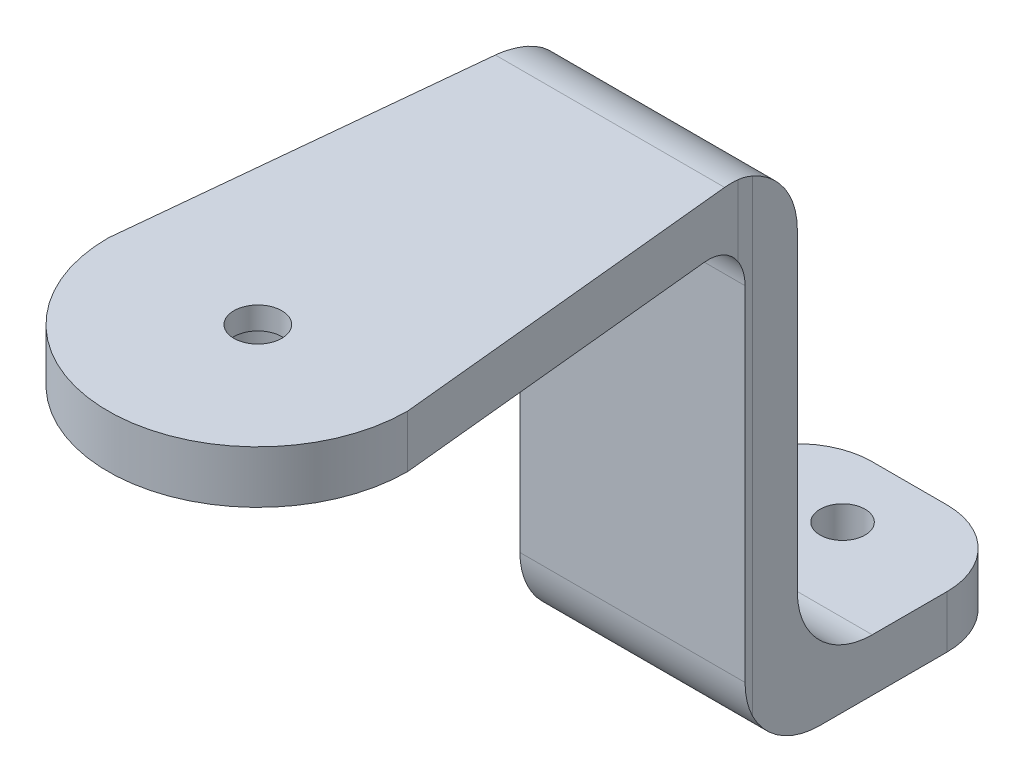
ISO-10303-21;
HEADER;
FILE_DESCRIPTION(('STEP AP214'),'2;1');
FILE_NAME('part.step','',(''),(''),'','','');
FILE_SCHEMA(('AUTOMOTIVE_DESIGN { 1 0 10303 214 1 1 1 1 }'));
ENDSEC;
DATA;
#1=APPLICATION_CONTEXT('core data for automotive mechanical design processes');
#2=APPLICATION_PROTOCOL_DEFINITION('international standard','automotive_design',2000,#1);
#3=PRODUCT_CONTEXT('',#1,'mechanical');
#4=PRODUCT('Part','Part','',(#3));
#5=PRODUCT_RELATED_PRODUCT_CATEGORY('part','',(#4));
#6=PRODUCT_DEFINITION_FORMATION('','',#4);
#7=PRODUCT_DEFINITION_CONTEXT('part definition',#1,'design');
#8=PRODUCT_DEFINITION('design','',#6,#7);
#9=PRODUCT_DEFINITION_SHAPE('','',#8);
#10=(LENGTH_UNIT() NAMED_UNIT(*) SI_UNIT(.MILLI.,.METRE.));
#11=(NAMED_UNIT(*) PLANE_ANGLE_UNIT() SI_UNIT($,.RADIAN.));
#12=(NAMED_UNIT(*) SI_UNIT($,.STERADIAN.) SOLID_ANGLE_UNIT());
#13=UNCERTAINTY_MEASURE_WITH_UNIT(LENGTH_MEASURE(1.E-05),#10,'distance_accuracy_value','');
#14=(GEOMETRIC_REPRESENTATION_CONTEXT(3) GLOBAL_UNCERTAINTY_ASSIGNED_CONTEXT((#13)) GLOBAL_UNIT_ASSIGNED_CONTEXT((#10,
#11,#12)) REPRESENTATION_CONTEXT('',''));
#15=CARTESIAN_POINT('',(0.,0.,0.));
#16=DIRECTION('',(0.,0.,1.));
#17=DIRECTION('',(1.,0.,0.));
#18=AXIS2_PLACEMENT_3D('',#15,#16,#17);
#19=CARTESIAN_POINT('',(10.,0.,0.));
#20=DIRECTION('',(0.,1.,0.));
#21=DIRECTION('',(0.,0.,1.));
#22=AXIS2_PLACEMENT_3D('',#19,#20,#21);
#23=PLANE('',#22);
#24=DIRECTION('',(0.0995037190209989,0.,-0.995037190209989));
#25=VECTOR('',#24,1.);
#26=CARTESIAN_POINT('',(0.0990099009900991,0.,-0.99009900990099));
#27=LINE('',#26,#25);
#28=CARTESIAN_POINT('',(0.,0.,0.));
#29=VERTEX_POINT('',#28);
#30=CARTESIAN_POINT('',(2.2,0.,-22.));
#31=VERTEX_POINT('',#30);
#32=EDGE_CURVE('E215',#29,#31,#27,.T.);
#33=ORIENTED_EDGE('',*,*,#32,.T.);
#34=DIRECTION('',(-1.,0.,0.));
#35=VECTOR('',#34,1.);
#36=CARTESIAN_POINT('',(17.5,0.,-22.));
#37=LINE('',#36,#35);
#38=CARTESIAN_POINT('',(17.8,0.,-22.));
#39=VERTEX_POINT('',#38);
#40=EDGE_CURVE('E255',#31,#39,#37,.F.);
#41=ORIENTED_EDGE('',*,*,#40,.T.);
#42=DIRECTION('',(0.0995037190209989,0.,0.995037190209989));
#43=VECTOR('',#42,1.);
#44=CARTESIAN_POINT('',(19.9009900990099,0.,-0.99009900990099));
#45=LINE('',#44,#43);
#46=CARTESIAN_POINT('',(20.,0.,0.));
#47=VERTEX_POINT('',#46);
#48=EDGE_CURVE('E219',#39,#47,#45,.T.);
#49=ORIENTED_EDGE('',*,*,#48,.T.);
#50=CARTESIAN_POINT('',(10.,0.,0.));
#51=DIRECTION('',(0.,1.,0.));
#52=DIRECTION('',(0.,0.,1.));
#53=AXIS2_PLACEMENT_3D('',#50,#51,#52);
#54=CIRCLE('',#53,10.);
#55=EDGE_CURVE('E244',#29,#47,#54,.T.);
#56=ORIENTED_EDGE('',*,*,#55,.F.);
#57=EDGE_LOOP('',(#33,#41,#49,#56));
#58=FACE_BOUND('',#57,.T.);
#59=CARTESIAN_POINT('',(10.,0.,0.));
#60=DIRECTION('',(0.,1.,0.));
#61=DIRECTION('',(0.,0.,1.));
#62=AXIS2_PLACEMENT_3D('',#59,#60,#61);
#63=CIRCLE('',#62,3.);
#64=CARTESIAN_POINT('',(10.,0.,3.));
#65=VERTEX_POINT('',#64);
#66=EDGE_CURVE('E241',#65,#65,#63,.T.);
#67=ORIENTED_EDGE('',*,*,#66,.T.);
#68=EDGE_LOOP('',(#67));
#69=FACE_BOUND('',#68,.T.);
#70=ADVANCED_FACE('F43',(#58,#69),#23,.F.);
#71=CARTESIAN_POINT('',(10.,2.,0.));
#72=DIRECTION('',(0.,-1.,0.));
#73=DIRECTION('',(0.,0.,-1.));
#74=AXIS2_PLACEMENT_3D('',#71,#72,#73);
#75=CYLINDRICAL_SURFACE('',#74,10.);
#76=ORIENTED_EDGE('',*,*,#55,.T.);
#77=DIRECTION('',(0.,-1.,0.));
#78=VECTOR('',#77,1.);
#79=CARTESIAN_POINT('',(20.,2.,0.));
#80=LINE('',#79,#78);
#81=CARTESIAN_POINT('',(20.,3.5,0.));
#82=VERTEX_POINT('',#81);
#83=EDGE_CURVE('E250',#82,#47,#80,.T.);
#84=ORIENTED_EDGE('',*,*,#83,.F.);
#85=CARTESIAN_POINT('',(10.,3.5,0.));
#86=DIRECTION('',(0.,1.,0.));
#87=DIRECTION('',(0.,0.,1.));
#88=AXIS2_PLACEMENT_3D('',#85,#86,#87);
#89=CIRCLE('',#88,10.);
#90=CARTESIAN_POINT('',(0.,3.5,0.));
#91=VERTEX_POINT('',#90);
#92=EDGE_CURVE('E233',#91,#82,#89,.T.);
#93=ORIENTED_EDGE('',*,*,#92,.F.);
#94=DIRECTION('',(0.,-1.,0.));
#95=VECTOR('',#94,1.);
#96=CARTESIAN_POINT('',(0.,2.,0.));
#97=LINE('',#96,#95);
#98=EDGE_CURVE('E247',#91,#29,#97,.T.);
#99=ORIENTED_EDGE('',*,*,#98,.T.);
#100=EDGE_LOOP('',(#76,#84,#93,#99));
#101=FACE_BOUND('',#100,.T.);
#102=ADVANCED_FACE('F442',(#101),#75,.T.);
#103=CARTESIAN_POINT('',(10.,2.,0.));
#104=DIRECTION('',(0.,-1.,0.));
#105=DIRECTION('',(0.,0.,-1.));
#106=AXIS2_PLACEMENT_3D('',#103,#104,#105);
#107=CYLINDRICAL_SURFACE('',#106,3.);
#108=CARTESIAN_POINT('',(10.,2.,0.));
#109=DIRECTION('',(0.,1.,0.));
#110=DIRECTION('',(0.,0.,1.));
#111=AXIS2_PLACEMENT_3D('',#108,#109,#110);
#112=CIRCLE('',#111,3.);
#113=CARTESIAN_POINT('',(10.,2.,3.));
#114=VERTEX_POINT('',#113);
#115=EDGE_CURVE('E238',#114,#114,#112,.T.);
#116=ORIENTED_EDGE('',*,*,#115,.T.);
#117=EDGE_LOOP('',(#116));
#118=FACE_BOUND('',#117,.T.);
#119=ORIENTED_EDGE('',*,*,#66,.F.);
#120=EDGE_LOOP('',(#119));
#121=FACE_BOUND('',#120,.T.);
#122=ADVANCED_FACE('F449',(#118,#121),#107,.F.);
#123=CARTESIAN_POINT('',(10.,2.,0.));
#124=DIRECTION('',(0.,1.,0.));
#125=DIRECTION('',(0.,0.,1.));
#126=AXIS2_PLACEMENT_3D('',#123,#124,#125);
#127=PLANE('',#126);
#128=CARTESIAN_POINT('',(10.,2.,0.));
#129=DIRECTION('',(0.,1.,0.));
#130=DIRECTION('',(0.,0.,1.));
#131=AXIS2_PLACEMENT_3D('',#128,#129,#130);
#132=CIRCLE('',#131,1.6);
#133=CARTESIAN_POINT('',(10.,2.,1.6));
#134=VERTEX_POINT('',#133);
#135=EDGE_CURVE('E229',#134,#134,#132,.T.);
#136=ORIENTED_EDGE('',*,*,#135,.T.);
#137=EDGE_LOOP('',(#136));
#138=FACE_BOUND('',#137,.T.);
#139=ORIENTED_EDGE('',*,*,#115,.F.);
#140=EDGE_LOOP('',(#139));
#141=FACE_BOUND('',#140,.T.);
#142=ADVANCED_FACE('F455',(#138,#141),#127,.F.);
#143=CARTESIAN_POINT('',(10.,3.5,0.));
#144=DIRECTION('',(0.,1.,0.));
#145=DIRECTION('',(0.,0.,1.));
#146=AXIS2_PLACEMENT_3D('',#143,#144,#145);
#147=PLANE('',#146);
#148=DIRECTION('',(0.0995037190209989,0.,0.995037190209989));
#149=VECTOR('',#148,1.);
#150=CARTESIAN_POINT('',(17.5,3.5,-25.));
#151=LINE('',#150,#149);
#152=CARTESIAN_POINT('',(17.65,3.5,-23.5));
#153=VERTEX_POINT('',#152);
#154=EDGE_CURVE('E211',#153,#82,#151,.T.);
#155=ORIENTED_EDGE('',*,*,#154,.F.);
#156=DIRECTION('',(1.,0.,0.));
#157=VECTOR('',#156,1.);
#158=CARTESIAN_POINT('',(10.,3.5,-23.5));
#159=LINE('',#158,#157);
#160=CARTESIAN_POINT('',(2.35,3.5,-23.5));
#161=VERTEX_POINT('',#160);
#162=EDGE_CURVE('E373',#153,#161,#159,.F.);
#163=ORIENTED_EDGE('',*,*,#162,.T.);
#164=DIRECTION('',(0.0995037190209989,0.,-0.995037190209989));
#165=VECTOR('',#164,1.);
#166=CARTESIAN_POINT('',(2.5,3.5,-25.));
#167=LINE('',#166,#165);
#168=EDGE_CURVE('E212',#91,#161,#167,.T.);
#169=ORIENTED_EDGE('',*,*,#168,.F.);
#170=ORIENTED_EDGE('',*,*,#92,.T.);
#171=EDGE_LOOP('',(#155,#163,#169,#170));
#172=FACE_BOUND('',#171,.T.);
#173=CARTESIAN_POINT('',(10.,3.5,0.));
#174=DIRECTION('',(0.,1.,0.));
#175=DIRECTION('',(0.,0.,1.));
#176=AXIS2_PLACEMENT_3D('',#173,#174,#175);
#177=CIRCLE('',#176,1.6);
#178=CARTESIAN_POINT('',(10.,3.5,1.6));
#179=VERTEX_POINT('',#178);
#180=EDGE_CURVE('E230',#179,#179,#177,.T.);
#181=ORIENTED_EDGE('',*,*,#180,.F.);
#182=EDGE_LOOP('',(#181));
#183=FACE_BOUND('',#182,.T.);
#184=ADVANCED_FACE('F459',(#172,#183),#147,.T.);
#185=CARTESIAN_POINT('',(10.,3.5,0.));
#186=DIRECTION('',(0.,-1.,0.));
#187=DIRECTION('',(0.,0.,-1.));
#188=AXIS2_PLACEMENT_3D('',#185,#186,#187);
#189=CYLINDRICAL_SURFACE('',#188,1.6);
#190=ORIENTED_EDGE('',*,*,#180,.T.);
#191=EDGE_LOOP('',(#190));
#192=FACE_BOUND('',#191,.T.);
#193=ORIENTED_EDGE('',*,*,#135,.F.);
#194=EDGE_LOOP('',(#193));
#195=FACE_BOUND('',#194,.T.);
#196=ADVANCED_FACE('F463',(#192,#195),#189,.F.);
#197=CARTESIAN_POINT('',(0.,0.,-25.));
#198=DIRECTION('',(0.,0.,-1.));
#199=DIRECTION('',(-1.,0.,0.));
#200=AXIS2_PLACEMENT_3D('',#197,#198,#199);
#201=PLANE('',#200);
#202=DIRECTION('',(0.,-1.,0.));
#203=VECTOR('',#202,1.);
#204=CARTESIAN_POINT('',(2.48755436740049,-3.,-25.));
#205=LINE('',#204,#203);
#206=CARTESIAN_POINT('',(2.48755436740049,-3.,-25.));
#207=VERTEX_POINT('',#206);
#208=CARTESIAN_POINT('',(2.48755436740048,-25.93,-24.9999999999999));
#209=VERTEX_POINT('',#208);
#210=EDGE_CURVE('E352',#207,#209,#205,.T.);
#211=ORIENTED_EDGE('',*,*,#210,.T.);
#212=DIRECTION('',(-1.,0.,0.));
#213=VECTOR('',#212,1.);
#214=CARTESIAN_POINT('',(0.,-25.93,-25.));
#215=LINE('',#214,#213);
#216=CARTESIAN_POINT('',(17.5124456325995,-25.93,-25.));
#217=VERTEX_POINT('',#216);
#218=EDGE_CURVE('E312',#209,#217,#215,.F.);
#219=ORIENTED_EDGE('',*,*,#218,.T.);
#220=DIRECTION('',(0.,1.,0.));
#221=VECTOR('',#220,1.);
#222=CARTESIAN_POINT('',(17.5124456325995,-30.93,-25.));
#223=LINE('',#222,#221);
#224=CARTESIAN_POINT('',(17.5124456325995,-3.,-25.));
#225=VERTEX_POINT('',#224);
#226=EDGE_CURVE('E273',#217,#225,#223,.T.);
#227=ORIENTED_EDGE('',*,*,#226,.T.);
#228=DIRECTION('',(-1.,0.,0.));
#229=VECTOR('',#228,1.);
#230=CARTESIAN_POINT('',(2.5,-3.,-25.));
#231=LINE('',#230,#229);
#232=EDGE_CURVE('E253',#225,#207,#231,.T.);
#233=ORIENTED_EDGE('',*,*,#232,.T.);
#234=EDGE_LOOP('',(#211,#219,#227,#233));
#235=FACE_BOUND('',#234,.T.);
#236=ADVANCED_FACE('F350',(#235),#201,.F.);
#237=CARTESIAN_POINT('',(17.5,3.5,-28.5));
#238=DIRECTION('',(-1.,0.,0.));
#239=DIRECTION('',(0.,-1.,0.));
#240=AXIS2_PLACEMENT_3D('',#237,#238,#239);
#241=PLANE('',#240);
#242=DIRECTION('',(0.,0.,1.));
#243=VECTOR('',#242,1.);
#244=CARTESIAN_POINT('',(17.5,-30.93,-28.5));
#245=LINE('',#244,#243);
#246=CARTESIAN_POINT('',(17.5,-30.93,-38.5));
#247=VERTEX_POINT('',#246);
#248=CARTESIAN_POINT('',(17.5,-30.93,-30.));
#249=VERTEX_POINT('',#248);
#250=EDGE_CURVE('E227',#247,#249,#245,.T.);
#251=ORIENTED_EDGE('',*,*,#250,.F.);
#252=DIRECTION('',(0.,-1.,0.));
#253=VECTOR('',#252,1.);
#254=CARTESIAN_POINT('',(17.5,3.5,-38.5));
#255=LINE('',#254,#253);
#256=CARTESIAN_POINT('',(17.5,-27.43,-38.5));
#257=VERTEX_POINT('',#256);
#258=EDGE_CURVE('E66',#247,#257,#255,.F.);
#259=ORIENTED_EDGE('',*,*,#258,.T.);
#260=DIRECTION('',(0.,0.,1.));
#261=VECTOR('',#260,1.);
#262=CARTESIAN_POINT('',(17.5,-27.43,-43.5));
#263=LINE('',#262,#261);
#264=CARTESIAN_POINT('',(17.5,-27.43,-33.5));
#265=VERTEX_POINT('',#264);
#266=EDGE_CURVE('E188',#257,#265,#263,.T.);
#267=ORIENTED_EDGE('',*,*,#266,.T.);
#268=CARTESIAN_POINT('',(17.5,-22.43,-33.5));
#269=DIRECTION('',(-1.,0.,0.));
#270=DIRECTION('',(0.,-1.,0.));
#271=AXIS2_PLACEMENT_3D('',#268,#269,#270);
#272=CIRCLE('',#271,5.);
#273=CARTESIAN_POINT('',(17.5,-22.43,-28.5));
#274=VERTEX_POINT('',#273);
#275=EDGE_CURVE('E382',#265,#274,#272,.T.);
#276=ORIENTED_EDGE('',*,*,#275,.T.);
#277=DIRECTION('',(0.,-1.,0.));
#278=VECTOR('',#277,1.);
#279=CARTESIAN_POINT('',(17.5,3.5,-28.5));
#280=LINE('',#279,#278);
#281=CARTESIAN_POINT('',(17.5,-1.5,-28.5));
#282=VERTEX_POINT('',#281);
#283=EDGE_CURVE('E221',#282,#274,#280,.T.);
#284=ORIENTED_EDGE('',*,*,#283,.F.);
#285=CARTESIAN_POINT('',(17.5,-1.5,-23.5));
#286=DIRECTION('',(-1.,0.,0.));
#287=DIRECTION('',(0.,-1.,0.));
#288=AXIS2_PLACEMENT_3D('',#285,#286,#287);
#289=CIRCLE('',#288,5.);
#290=CARTESIAN_POINT('',(17.5,3.08311832796775,-25.4987562112089));
#291=VERTEX_POINT('',#290);
#292=EDGE_CURVE('E362',#282,#291,#289,.F.);
#293=ORIENTED_EDGE('',*,*,#292,.T.);
#294=DIRECTION('',(0.,-1.,0.));
#295=VECTOR('',#294,1.);
#296=CARTESIAN_POINT('',(17.5,-3.,-25.4987562112089));
#297=LINE('',#296,#295);
#298=CARTESIAN_POINT('',(17.5,-28.1068794991615,-25.4987562112089));
#299=VERTEX_POINT('',#298);
#300=EDGE_CURVE('E262',#291,#299,#297,.T.);
#301=ORIENTED_EDGE('',*,*,#300,.T.);
#302=CARTESIAN_POINT('',(17.5,-25.93,-30.));
#303=DIRECTION('',(-1.,0.,0.));
#304=DIRECTION('',(0.,-1.,0.));
#305=AXIS2_PLACEMENT_3D('',#302,#303,#304);
#306=CIRCLE('',#305,5.);
#307=EDGE_CURVE('E361',#299,#249,#306,.F.);
#308=ORIENTED_EDGE('',*,*,#307,.T.);
#309=EDGE_LOOP('',(#251,#259,#267,#276,#284,#293,#301,#308));
#310=FACE_BOUND('',#309,.T.);
#311=ADVANCED_FACE('F409',(#310),#241,.F.);
#312=CARTESIAN_POINT('',(17.5,-30.93,-28.5));
#313=DIRECTION('',(0.,1.,0.));
#314=DIRECTION('',(-1.,0.,0.));
#315=AXIS2_PLACEMENT_3D('',#312,#313,#314);
#316=PLANE('',#315);
#317=CARTESIAN_POINT('',(9.99999999999999,-30.93,-39.02));
#318=DIRECTION('',(0.,1.,0.));
#319=DIRECTION('',(-1.,0.,0.));
#320=AXIS2_PLACEMENT_3D('',#317,#318,#319);
#321=CIRCLE('',#320,1.5);
#322=CARTESIAN_POINT('',(8.49999999999999,-30.93,-39.02));
#323=VERTEX_POINT('',#322);
#324=EDGE_CURVE('E197',#323,#323,#321,.T.);
#325=ORIENTED_EDGE('',*,*,#324,.T.);
#326=EDGE_LOOP('',(#325));
#327=FACE_BOUND('',#326,.T.);
#328=DIRECTION('',(-1.,0.,0.));
#329=VECTOR('',#328,1.);
#330=CARTESIAN_POINT('',(17.5,-30.93,-43.5));
#331=LINE('',#330,#329);
#332=CARTESIAN_POINT('',(12.5,-30.93,-43.5));
#333=VERTEX_POINT('',#332);
#334=CARTESIAN_POINT('',(7.48755436740048,-30.93,-43.5));
#335=VERTEX_POINT('',#334);
#336=EDGE_CURVE('E202',#333,#335,#331,.T.);
#337=ORIENTED_EDGE('',*,*,#336,.F.);
#338=CARTESIAN_POINT('',(12.5,-30.93,-38.5));
#339=DIRECTION('',(0.,1.,0.));
#340=DIRECTION('',(-1.,0.,0.));
#341=AXIS2_PLACEMENT_3D('',#338,#339,#340);
#342=CIRCLE('',#341,5.);
#343=EDGE_CURVE('E394',#333,#247,#342,.F.);
#344=ORIENTED_EDGE('',*,*,#343,.T.);
#345=ORIENTED_EDGE('',*,*,#250,.T.);
#346=DIRECTION('',(-1.,0.,0.));
#347=VECTOR('',#346,1.);
#348=CARTESIAN_POINT('',(17.5,-30.93,-30.));
#349=LINE('',#348,#347);
#350=CARTESIAN_POINT('',(2.48755436740048,-30.93,-30.));
#351=VERTEX_POINT('',#350);
#352=EDGE_CURVE('E410',#249,#351,#349,.T.);
#353=ORIENTED_EDGE('',*,*,#352,.T.);
#354=DIRECTION('',(0.,0.,1.));
#355=VECTOR('',#354,1.);
#356=CARTESIAN_POINT('',(2.48755436740048,-30.93,-43.5));
#357=LINE('',#356,#355);
#358=CARTESIAN_POINT('',(2.48755436740048,-30.93,-38.5));
#359=VERTEX_POINT('',#358);
#360=EDGE_CURVE('E187',#359,#351,#357,.T.);
#361=ORIENTED_EDGE('',*,*,#360,.F.);
#362=CARTESIAN_POINT('',(7.48755436740048,-30.93,-38.5));
#363=DIRECTION('',(0.,1.,0.));
#364=DIRECTION('',(-1.,0.,0.));
#365=AXIS2_PLACEMENT_3D('',#362,#363,#364);
#366=CIRCLE('',#365,5.);
#367=EDGE_CURVE('E392',#359,#335,#366,.F.);
#368=ORIENTED_EDGE('',*,*,#367,.T.);
#369=EDGE_LOOP('',(#337,#344,#345,#353,#361,#368));
#370=FACE_BOUND('',#369,.T.);
#371=ADVANCED_FACE('F407',(#327,#370),#316,.F.);
#372=CARTESIAN_POINT('',(2.5,3.5,-28.5));
#373=DIRECTION('',(1.,0.,0.));
#374=DIRECTION('',(0.,1.,0.));
#375=AXIS2_PLACEMENT_3D('',#372,#373,#374);
#376=PLANE('',#375);
#377=DIRECTION('',(0.,1.,0.));
#378=VECTOR('',#377,1.);
#379=CARTESIAN_POINT('',(2.5,3.5,-28.5));
#380=LINE('',#379,#378);
#381=CARTESIAN_POINT('',(2.49999999999999,-30.6996960070847,-28.5));
#382=VERTEX_POINT('',#381);
#383=CARTESIAN_POINT('',(2.49999999999999,-27.43,-28.5));
#384=VERTEX_POINT('',#383);
#385=EDGE_CURVE('E201',#382,#384,#380,.T.);
#386=ORIENTED_EDGE('',*,*,#385,.F.);
#387=CARTESIAN_POINT('',(2.49999999999999,-25.93,-30.));
#388=DIRECTION('',(1.,0.,0.));
#389=DIRECTION('',(0.,1.,0.));
#390=AXIS2_PLACEMENT_3D('',#387,#388,#389);
#391=CIRCLE('',#390,5.);
#392=CARTESIAN_POINT('',(2.49999999999999,-28.1068794991613,-25.4987562112088));
#393=VERTEX_POINT('',#392);
#394=EDGE_CURVE('E336',#382,#393,#391,.F.);
#395=ORIENTED_EDGE('',*,*,#394,.T.);
#396=DIRECTION('',(0.,1.,0.));
#397=VECTOR('',#396,1.);
#398=CARTESIAN_POINT('',(2.5,3.5,-25.4987562112089));
#399=LINE('',#398,#397);
#400=CARTESIAN_POINT('',(2.5,3.08311832796775,-25.4987562112089));
#401=VERTEX_POINT('',#400);
#402=EDGE_CURVE('E268',#393,#401,#399,.T.);
#403=ORIENTED_EDGE('',*,*,#402,.T.);
#404=CARTESIAN_POINT('',(2.5,-1.5,-23.5));
#405=DIRECTION('',(1.,0.,0.));
#406=DIRECTION('',(0.,1.,0.));
#407=AXIS2_PLACEMENT_3D('',#404,#405,#406);
#408=CIRCLE('',#407,5.);
#409=CARTESIAN_POINT('',(2.5,-1.5,-28.5));
#410=VERTEX_POINT('',#409);
#411=EDGE_CURVE('E416',#401,#410,#408,.F.);
#412=ORIENTED_EDGE('',*,*,#411,.T.);
#413=CARTESIAN_POINT('',(2.49999999999999,-22.43,-28.5));
#414=VERTEX_POINT('',#413);
#415=EDGE_CURVE('E224',#414,#410,#380,.T.);
#416=ORIENTED_EDGE('',*,*,#415,.F.);
#417=CARTESIAN_POINT('',(2.49999999999999,-22.43,-33.5));
#418=DIRECTION('',(1.,0.,0.));
#419=DIRECTION('',(0.,1.,0.));
#420=AXIS2_PLACEMENT_3D('',#417,#418,#419);
#421=CIRCLE('',#420,5.);
#422=CARTESIAN_POINT('',(2.49999999999999,-27.43,-33.5));
#423=VERTEX_POINT('',#422);
#424=EDGE_CURVE('E384',#414,#423,#421,.T.);
#425=ORIENTED_EDGE('',*,*,#424,.T.);
#426=DIRECTION('',(0.,0.,-1.));
#427=VECTOR('',#426,1.);
#428=CARTESIAN_POINT('',(2.49999999999999,-27.43,-28.5));
#429=LINE('',#428,#427);
#430=EDGE_CURVE('E377',#384,#423,#429,.T.);
#431=ORIENTED_EDGE('',*,*,#430,.F.);
#432=EDGE_LOOP('',(#386,#395,#403,#412,#416,#425,#431));
#433=FACE_BOUND('',#432,.T.);
#434=ADVANCED_FACE('F421',(#433),#376,.F.);
#435=CARTESIAN_POINT('',(0.,0.,-28.5));
#436=DIRECTION('',(0.,0.,-1.));
#437=DIRECTION('',(-1.,0.,0.));
#438=AXIS2_PLACEMENT_3D('',#435,#436,#437);
#439=PLANE('',#438);
#440=ORIENTED_EDGE('',*,*,#415,.T.);
#441=DIRECTION('',(1.,0.,0.));
#442=VECTOR('',#441,1.);
#443=CARTESIAN_POINT('',(0.,-1.5,-28.5));
#444=LINE('',#443,#442);
#445=EDGE_CURVE('E368',#410,#282,#444,.T.);
#446=ORIENTED_EDGE('',*,*,#445,.T.);
#447=ORIENTED_EDGE('',*,*,#283,.T.);
#448=DIRECTION('',(1.,0.,0.));
#449=VECTOR('',#448,1.);
#450=CARTESIAN_POINT('',(0.,-22.43,-28.5));
#451=LINE('',#450,#449);
#452=EDGE_CURVE('E364',#274,#414,#451,.F.);
#453=ORIENTED_EDGE('',*,*,#452,.T.);
#454=EDGE_LOOP('',(#440,#446,#447,#453));
#455=FACE_BOUND('',#454,.T.);
#456=ADVANCED_FACE('F430',(#455),#439,.T.);
#457=CARTESIAN_POINT('',(2.5,-1.5,-25.));
#458=DIRECTION('',(0.995037190209989,0.,0.0995037190209989));
#459=DIRECTION('',(0.0995037190209989,0.,-0.995037190209989));
#460=AXIS2_PLACEMENT_3D('',#457,#458,#459);
#461=PLANE('',#460);
#462=ORIENTED_EDGE('',*,*,#168,.T.);
#463=CARTESIAN_POINT('',(2.35,-1.5,-23.5));
#464=DIRECTION('',(0.995037190209989,0.,0.0995037190209989));
#465=DIRECTION('',(0.0995037190209989,0.,-0.995037190209989));
#466=AXIS2_PLACEMENT_3D('',#463,#464,#465);
#467=ELLIPSE('',#466,5.02493781056044,5.);
#468=CARTESIAN_POINT('',(2.45037190209989,3.39821887290523,-24.5037190209989));
#469=VERTEX_POINT('',#468);
#470=EDGE_CURVE('E375',#161,#469,#467,.F.);
#471=ORIENTED_EDGE('',*,*,#470,.T.);
#472=DIRECTION('',(0.,1.,0.));
#473=VECTOR('',#472,1.);
#474=CARTESIAN_POINT('',(2.45037190209989,-3.,-24.5037190209989));
#475=LINE('',#474,#473);
#476=CARTESIAN_POINT('',(2.45037190209989,-1.34730793434217,-24.5037190209989));
#477=VERTEX_POINT('',#476);
#478=EDGE_CURVE('E271',#469,#477,#475,.F.);
#479=ORIENTED_EDGE('',*,*,#478,.T.);
#480=CARTESIAN_POINT('',(2.2,-3.,-22.));
#481=DIRECTION('',(0.995037190209989,0.,0.0995037190209989));
#482=DIRECTION('',(0.0995037190209989,0.,-0.995037190209989));
#483=AXIS2_PLACEMENT_3D('',#480,#481,#482);
#484=ELLIPSE('',#483,3.01496268633627,3.);
#485=EDGE_CURVE('E257',#477,#31,#484,.T.);
#486=ORIENTED_EDGE('',*,*,#485,.T.);
#487=ORIENTED_EDGE('',*,*,#32,.F.);
#488=ORIENTED_EDGE('',*,*,#98,.F.);
#489=EDGE_LOOP('',(#462,#471,#479,#486,#487,#488));
#490=FACE_BOUND('',#489,.T.);
#491=ADVANCED_FACE('F478',(#490),#461,.F.);
#492=CARTESIAN_POINT('',(17.5,-1.5,-25.));
#493=DIRECTION('',(-0.995037190209989,0.,0.0995037190209989));
#494=DIRECTION('',(0.0995037190209989,0.,0.995037190209989));
#495=AXIS2_PLACEMENT_3D('',#492,#493,#494);
#496=PLANE('',#495);
#497=DIRECTION('',(0.,-1.,0.));
#498=VECTOR('',#497,1.);
#499=CARTESIAN_POINT('',(17.5496280979001,3.5,-24.5037190209989));
#500=LINE('',#499,#498);
#501=CARTESIAN_POINT('',(17.5496280979001,-1.34730793434217,-24.5037190209989));
#502=VERTEX_POINT('',#501);
#503=CARTESIAN_POINT('',(17.5496280979001,3.39821887290524,-24.5037190209989));
#504=VERTEX_POINT('',#503);
#505=EDGE_CURVE('E265',#502,#504,#500,.F.);
#506=ORIENTED_EDGE('',*,*,#505,.T.);
#507=CARTESIAN_POINT('',(17.65,-1.5,-23.5));
#508=DIRECTION('',(-0.995037190209989,0.,0.0995037190209989));
#509=DIRECTION('',(0.0995037190209989,0.,0.995037190209989));
#510=AXIS2_PLACEMENT_3D('',#507,#508,#509);
#511=ELLIPSE('',#510,5.02493781056044,5.);
#512=EDGE_CURVE('E371',#504,#153,#511,.F.);
#513=ORIENTED_EDGE('',*,*,#512,.T.);
#514=ORIENTED_EDGE('',*,*,#154,.T.);
#515=ORIENTED_EDGE('',*,*,#83,.T.);
#516=ORIENTED_EDGE('',*,*,#48,.F.);
#517=CARTESIAN_POINT('',(17.8,-3.,-22.));
#518=DIRECTION('',(-0.995037190209989,0.,0.0995037190209989));
#519=DIRECTION('',(0.0995037190209989,0.,0.995037190209989));
#520=AXIS2_PLACEMENT_3D('',#517,#518,#519);
#521=ELLIPSE('',#520,3.01496268633627,3.);
#522=EDGE_CURVE('E259',#39,#502,#521,.T.);
#523=ORIENTED_EDGE('',*,*,#522,.T.);
#524=EDGE_LOOP('',(#506,#513,#514,#515,#516,#523));
#525=FACE_BOUND('',#524,.T.);
#526=ADVANCED_FACE('F479',(#525),#496,.F.);
#527=CARTESIAN_POINT('',(0.,-3.,-22.));
#528=DIRECTION('',(1.,0.,0.));
#529=DIRECTION('',(0.,0.,-1.));
#530=AXIS2_PLACEMENT_3D('',#527,#528,#529);
#531=CYLINDRICAL_SURFACE('',#530,3.);
#532=ORIENTED_EDGE('',*,*,#522,.F.);
#533=ORIENTED_EDGE('',*,*,#40,.F.);
#534=ORIENTED_EDGE('',*,*,#485,.F.);
#535=CARTESIAN_POINT('',(2.45037190209989,-1.34730793434217,-24.5037190209989));
#536=CARTESIAN_POINT('',(2.45504644568927,-1.41816790408431,-24.5505054063142));
#537=CARTESIAN_POINT('',(2.45909475841755,-1.49104986765087,-24.594282997067));
#538=CARTESIAN_POINT('',(2.46614154742207,-1.64030755514938,-24.6755262747904));
#539=CARTESIAN_POINT('',(2.46913993794004,-1.71668356390126,-24.712991446029));
#540=CARTESIAN_POINT('',(2.47422701893086,-1.87049900230153,-24.7804879682369));
#541=CARTESIAN_POINT('',(2.47633581662574,-1.94786890804076,-24.8106761619477));
#542=CARTESIAN_POINT('',(2.47990413395426,-2.10482377180094,-24.8645325741962));
#543=CARTESIAN_POINT('',(2.48136380743539,-2.18440820020642,-24.8882023371458));
#544=CARTESIAN_POINT('',(2.48434459414173,-2.38377195016474,-24.938584895848));
#545=CARTESIAN_POINT('',(2.48556188484773,-2.50458930395992,-24.9613488164791));
#546=CARTESIAN_POINT('',(2.48676639525919,-2.68825068136817,-24.9844137312878));
#547=CARTESIAN_POINT('',(2.48706410130343,-2.75045503317888,-24.9902560307444));
#548=CARTESIAN_POINT('',(2.48745715352987,-2.87509965145302,-24.9980484627593));
#549=CARTESIAN_POINT('',(2.48755252590212,-2.93753988633547,-24.9999990990521));
#550=CARTESIAN_POINT('',(2.48755436740048,-3.,-25.));
#551=B_SPLINE_CURVE_WITH_KNOTS('',3,(#535,#536,#537,#538,#539,#540,#541,#542,#543,#544,#545,
#546,#547,#548,#549,#550),.UNSPECIFIED.,.F.,.F.,(4,2,2,2,2,2,2,4),(0.,0.255036591621668,
0.510094009931417,0.759029552632214,1.00790606419024,1.37568558628311,1.56301998711835,
1.75033013793),.UNSPECIFIED.);
#552=EDGE_CURVE('E283',#477,#207,#551,.T.);
#553=ORIENTED_EDGE('',*,*,#552,.T.);
#554=ORIENTED_EDGE('',*,*,#232,.F.);
#555=CARTESIAN_POINT('',(17.5124456325995,-3.,-25.));
#556=CARTESIAN_POINT('',(17.5124535107547,-2.91495755118509,-25.0000090008739));
#557=CARTESIAN_POINT('',(17.5126264612046,-2.82991713088715,-24.9963840943599));
#558=CARTESIAN_POINT('',(17.5133594462795,-2.66043972251406,-24.9819320447598));
#559=CARTESIAN_POINT('',(17.5139195364109,-2.57600282272334,-24.9711038689074));
#560=CARTESIAN_POINT('',(17.5154649745206,-2.41037105876575,-24.9426568791029));
#561=CARTESIAN_POINT('',(17.5164397789658,-2.32914704791092,-24.9252075157039));
#562=CARTESIAN_POINT('',(17.5189139374899,-2.16846618636403,-24.8836507201203));
#563=CARTESIAN_POINT('',(17.5204131591249,-2.08900889486257,-24.8595449693608));
#564=CARTESIAN_POINT('',(17.5249421377835,-1.89491658111555,-24.7917379562893));
#565=CARTESIAN_POINT('',(17.528360896114,-1.78160200764093,-24.7441761879365));
#566=CARTESIAN_POINT('',(17.5350075450365,-1.61574748067768,-24.6622833162629));
#567=CARTESIAN_POINT('',(17.5375061349159,-1.56066635334725,-24.6329097120354));
#568=CARTESIAN_POINT('',(17.5430990736608,-1.45246976215662,-24.5708047436472));
#569=CARTESIAN_POINT('',(17.5461933610123,-1.39935409600957,-24.5380737263494));
#570=CARTESIAN_POINT('',(17.5496280979001,-1.34730793434217,-24.5037190209989));
#571=B_SPLINE_CURVE_WITH_KNOTS('',3,(#555,#556,#557,#558,#559,#560,#561,#562,#563,#564,#565,
#566,#567,#568,#569,#570),.UNSPECIFIED.,.F.,.F.,(4,2,2,2,2,2,2,4),(0.,0.255046610716832,
0.510129796546394,0.759082674424501,1.00797272343004,1.37571422836454,1.56303186042159,
1.75033015966999),.UNSPECIFIED.);
#572=EDGE_CURVE('E275',#225,#502,#571,.T.);
#573=ORIENTED_EDGE('',*,*,#572,.T.);
#574=EDGE_LOOP('',(#532,#533,#534,#553,#554,#573));
#575=FACE_BOUND('',#574,.T.);
#576=ADVANCED_FACE('F290',(#575),#531,.F.);
#577=CARTESIAN_POINT('',(27.5,3.5,-25.4987562112089));
#578=DIRECTION('',(0.,1.,0.));
#579=DIRECTION('',(0.,0.,1.));
#580=AXIS2_PLACEMENT_3D('',#577,#578,#579);
#581=CYLINDRICAL_SURFACE('',#580,10.);
#582=ORIENTED_EDGE('',*,*,#226,.F.);
#583=CARTESIAN_POINT('',(17.5124456325995,-25.93,-25.));
#584=CARTESIAN_POINT('',(17.5124696490535,-26.0718215893806,-24.9999837255));
#585=CARTESIAN_POINT('',(17.5121450862532,-26.2136428073741,-25.0060331983729));
#586=CARTESIAN_POINT('',(17.5109719052221,-26.4963235401564,-25.0301544202486));
#587=CARTESIAN_POINT('',(17.5101230447866,-26.6371825800328,-25.0482317259314));
#588=CARTESIAN_POINT('',(17.5080936847572,-26.9142488984423,-25.0958529960645));
#589=CARTESIAN_POINT('',(17.5069196348791,-27.0504939881318,-25.1251778425547));
#590=CARTESIAN_POINT('',(17.5045505735632,-27.3199937678392,-25.1950777784586));
#591=CARTESIAN_POINT('',(17.5033555748336,-27.4532501661845,-25.2356462542396));
#592=CARTESIAN_POINT('',(17.5016807411228,-27.6732929313469,-25.3128073755939));
#593=CARTESIAN_POINT('',(17.5010946572979,-27.7611347832466,-25.3464227174926));
#594=CARTESIAN_POINT('',(17.5002545734724,-27.9353400501755,-25.4187810609791));
#595=CARTESIAN_POINT('',(17.5000027169056,-28.0216904504684,-25.4575554209606));
#596=CARTESIAN_POINT('',(17.5,-28.1068794991615,-25.4987562112089));
#597=B_SPLINE_CURVE_WITH_KNOTS('',3,(#583,#584,#585,#586,#587,#588,#589,#590,#591,#592,#593,
#594,#595,#596),.UNSPECIFIED.,.F.,.F.,(4,2,2,2,2,2,4),(0.,0.42533634672271,0.850869329089825,
1.26850197857869,1.68588949119075,1.96791713221826,2.25174484291592),.UNSPECIFIED.);
#598=EDGE_CURVE('E311',#217,#299,#597,.T.);
#599=ORIENTED_EDGE('',*,*,#598,.T.);
#600=ORIENTED_EDGE('',*,*,#300,.F.);
#601=CARTESIAN_POINT('',(17.5,3.08311832796775,-25.4987562112089));
#602=CARTESIAN_POINT('',(17.4999965625023,3.11806531385573,-25.4186329733259));
#603=CARTESIAN_POINT('',(17.5009629768678,3.15090488192188,-25.3375882738497));
#604=CARTESIAN_POINT('',(17.5049359459278,3.2121770057064,-25.174205813644));
#605=CARTESIAN_POINT('',(17.5079357257557,3.24062381220765,-25.0918732310879));
#606=CARTESIAN_POINT('',(17.5160744855636,3.29315137901631,-24.9259290492471));
#607=CARTESIAN_POINT('',(17.5212134863107,3.31723209693567,-24.8423174375537));
#608=CARTESIAN_POINT('',(17.5337231185723,3.36104302288256,-24.6738285955772));
#609=CARTESIAN_POINT('',(17.541101116836,3.38075849227499,-24.5889480803958));
#610=CARTESIAN_POINT('',(17.5496280979001,3.39821887290523,-24.5037190209989));
#611=B_SPLINE_CURVE_WITH_KNOTS('',3,(#601,#602,#603,#604,#605,#606,#607,#608,#609,#610),
.UNSPECIFIED.,.F.,.F.,(4,2,2,2,4),(0.,0.262206462194659,0.523543558602343,0.784883192057701,
1.04709218317669),.UNSPECIFIED.);
#612=EDGE_CURVE('E304',#291,#504,#611,.T.);
#613=ORIENTED_EDGE('',*,*,#612,.T.);
#614=ORIENTED_EDGE('',*,*,#505,.F.);
#615=ORIENTED_EDGE('',*,*,#572,.F.);
#616=EDGE_LOOP('',(#582,#599,#600,#613,#614,#615));
#617=FACE_BOUND('',#616,.T.);
#618=ADVANCED_FACE('F293',(#617),#581,.F.);
#619=CARTESIAN_POINT('',(-7.5,3.50000000000001,-25.4987562112089));
#620=DIRECTION('',(0.,-1.,0.));
#621=DIRECTION('',(0.,0.,-1.));
#622=AXIS2_PLACEMENT_3D('',#619,#620,#621);
#623=CYLINDRICAL_SURFACE('',#622,10.);
#624=ORIENTED_EDGE('',*,*,#402,.F.);
#625=CARTESIAN_POINT('',(2.49999999999999,-28.1068794991613,-25.4987562112088));
#626=CARTESIAN_POINT('',(2.49998331320262,-27.9792107320776,-25.4369954947727));
#627=CARTESIAN_POINT('',(2.4994269212665,-27.8489032556546,-25.3806962517265));
#628=CARTESIAN_POINT('',(2.49772561563322,-27.5839199877438,-25.2793393995942));
#629=CARTESIAN_POINT('',(2.49658042563395,-27.449242173234,-25.2342870830512));
#630=CARTESIAN_POINT('',(2.49421552056644,-27.1790816485275,-25.1565303480054));
#631=CARTESIAN_POINT('',(2.49299758486152,-27.043660353991,-25.123612117694));
#632=CARTESIAN_POINT('',(2.49080751129393,-26.7706098087716,-25.0692054048256));
#633=CARTESIAN_POINT('',(2.4898352288195,-26.6329819080684,-25.047710189477));
#634=CARTESIAN_POINT('',(2.48860431967975,-26.4012928716631,-25.021372866902));
#635=CARTESIAN_POINT('',(2.48821650948612,-26.3075776334953,-25.0133908068406));
#636=CARTESIAN_POINT('',(2.4876886014966,-26.1192463217131,-25.0026865670236));
#637=CARTESIAN_POINT('',(2.48755010068088,-26.0246283163138,-24.9999982869632));
#638=CARTESIAN_POINT('',(2.48755436740048,-25.93,-25.));
#639=B_SPLINE_CURVE_WITH_KNOTS('',3,(#625,#626,#627,#628,#629,#630,#631,#632,#633,#634,#635,
#636,#637,#638),.UNSPECIFIED.,.F.,.F.,(4,2,2,2,2,2,4),(0.,0.425336954373522,0.850873686760936,
1.26850631228027,1.68589250890897,1.9679184835273,2.25174466511164),.UNSPECIFIED.);
#640=EDGE_CURVE('E335',#393,#209,#639,.T.);
#641=ORIENTED_EDGE('',*,*,#640,.T.);
#642=ORIENTED_EDGE('',*,*,#210,.F.);
#643=ORIENTED_EDGE('',*,*,#552,.F.);
#644=ORIENTED_EDGE('',*,*,#478,.F.);
#645=CARTESIAN_POINT('',(2.45037190209989,3.39821887290523,-24.5037190209989));
#646=CARTESIAN_POINT('',(2.45889888316397,3.38075849227499,-24.5889480803958));
#647=CARTESIAN_POINT('',(2.46627688142775,3.36104302288255,-24.6738285955772));
#648=CARTESIAN_POINT('',(2.47878651368933,3.31723209693566,-24.8423174375537));
#649=CARTESIAN_POINT('',(2.48392551443637,3.2931513790163,-24.9259290492471));
#650=CARTESIAN_POINT('',(2.4920642742443,3.24062381220765,-25.0918732310879));
#651=CARTESIAN_POINT('',(2.49506405407217,3.2121770057064,-25.1742058136441));
#652=CARTESIAN_POINT('',(2.49903702313222,3.15090488192188,-25.3375882738497));
#653=CARTESIAN_POINT('',(2.50000343749765,3.11806531385573,-25.418632973326));
#654=CARTESIAN_POINT('',(2.5,3.08311832796775,-25.4987562112089));
#655=B_SPLINE_CURVE_WITH_KNOTS('',3,(#645,#646,#647,#648,#649,#650,#651,#652,#653,#654),
.UNSPECIFIED.,.F.,.F.,(4,2,2,2,4),(0.,0.262208991118989,0.523548624574346,0.784885720982028,
1.04709218317669),.UNSPECIFIED.);
#656=EDGE_CURVE('E329',#469,#401,#655,.T.);
#657=ORIENTED_EDGE('',*,*,#656,.T.);
#658=EDGE_LOOP('',(#624,#641,#642,#643,#644,#657));
#659=FACE_BOUND('',#658,.T.);
#660=ADVANCED_FACE('F296',(#659),#623,.F.);
#661=CARTESIAN_POINT('',(2.48755436740048,-30.93,-43.5));
#662=DIRECTION('',(1.,0.,0.));
#663=DIRECTION('',(0.,1.,0.));
#664=AXIS2_PLACEMENT_3D('',#661,#662,#663);
#665=PLANE('',#664);
#666=DIRECTION('',(0.,0.,1.));
#667=VECTOR('',#666,1.);
#668=CARTESIAN_POINT('',(2.48755436740049,-27.43,-43.5));
#669=LINE('',#668,#667);
#670=CARTESIAN_POINT('',(2.48755436740049,-27.43,-38.5));
#671=VERTEX_POINT('',#670);
#672=CARTESIAN_POINT('',(2.48755436740049,-27.43,-28.5));
#673=VERTEX_POINT('',#672);
#674=EDGE_CURVE('E178',#671,#673,#669,.T.);
#675=ORIENTED_EDGE('',*,*,#674,.F.);
#676=DIRECTION('',(0.,1.,0.));
#677=VECTOR('',#676,1.);
#678=CARTESIAN_POINT('',(2.48755436740048,-30.93,-38.5));
#679=LINE('',#678,#677);
#680=EDGE_CURVE('E11',#671,#359,#679,.F.);
#681=ORIENTED_EDGE('',*,*,#680,.T.);
#682=ORIENTED_EDGE('',*,*,#360,.T.);
#683=CARTESIAN_POINT('',(2.48755436740049,-25.93,-30.));
#684=DIRECTION('',(1.,0.,0.));
#685=DIRECTION('',(0.,1.,0.));
#686=AXIS2_PLACEMENT_3D('',#683,#684,#685);
#687=CIRCLE('',#686,5.);
#688=CARTESIAN_POINT('',(2.48755436740048,-30.6996960070847,-28.5));
#689=VERTEX_POINT('',#688);
#690=EDGE_CURVE('E194',#351,#689,#687,.F.);
#691=ORIENTED_EDGE('',*,*,#690,.T.);
#692=DIRECTION('',(0.,1.,0.));
#693=VECTOR('',#692,1.);
#694=CARTESIAN_POINT('',(2.48755436740048,-30.93,-28.5));
#695=LINE('',#694,#693);
#696=EDGE_CURVE('E191',#689,#673,#695,.T.);
#697=ORIENTED_EDGE('',*,*,#696,.T.);
#698=EDGE_LOOP('',(#675,#681,#682,#691,#697));
#699=FACE_BOUND('',#698,.T.);
#700=ADVANCED_FACE('F192',(#699),#665,.F.);
#701=CARTESIAN_POINT('',(17.5,-27.43,-43.5));
#702=DIRECTION('',(0.,-1.,0.));
#703=DIRECTION('',(0.,0.,-1.));
#704=AXIS2_PLACEMENT_3D('',#701,#702,#703);
#705=PLANE('',#704);
#706=CARTESIAN_POINT('',(9.99999999999999,-27.43,-39.02));
#707=DIRECTION('',(0.,1.,0.));
#708=DIRECTION('',(0.,0.,1.));
#709=AXIS2_PLACEMENT_3D('',#706,#707,#708);
#710=CIRCLE('',#709,1.5);
#711=CARTESIAN_POINT('',(9.99999999999999,-27.43,-37.52));
#712=VERTEX_POINT('',#711);
#713=EDGE_CURVE('E504',#712,#712,#710,.T.);
#714=ORIENTED_EDGE('',*,*,#713,.F.);
#715=EDGE_LOOP('',(#714));
#716=FACE_BOUND('',#715,.T.);
#717=ORIENTED_EDGE('',*,*,#266,.F.);
#718=CARTESIAN_POINT('',(12.5,-27.43,-38.5));
#719=DIRECTION('',(0.,-1.,0.));
#720=DIRECTION('',(0.,0.,-1.));
#721=AXIS2_PLACEMENT_3D('',#718,#719,#720);
#722=CIRCLE('',#721,5.);
#723=CARTESIAN_POINT('',(12.5,-27.43,-43.5));
#724=VERTEX_POINT('',#723);
#725=EDGE_CURVE('E51',#257,#724,#722,.F.);
#726=ORIENTED_EDGE('',*,*,#725,.T.);
#727=DIRECTION('',(1.,0.,0.));
#728=VECTOR('',#727,1.);
#729=CARTESIAN_POINT('',(17.5,-27.43,-43.5));
#730=LINE('',#729,#728);
#731=CARTESIAN_POINT('',(7.48755436740049,-27.43,-43.5));
#732=VERTEX_POINT('',#731);
#733=EDGE_CURVE('E205',#732,#724,#730,.T.);
#734=ORIENTED_EDGE('',*,*,#733,.F.);
#735=CARTESIAN_POINT('',(7.48755436740048,-27.43,-38.5));
#736=DIRECTION('',(0.,-1.,0.));
#737=DIRECTION('',(0.,0.,-1.));
#738=AXIS2_PLACEMENT_3D('',#735,#736,#737);
#739=CIRCLE('',#738,5.);
#740=EDGE_CURVE('E58',#732,#671,#739,.F.);
#741=ORIENTED_EDGE('',*,*,#740,.T.);
#742=ORIENTED_EDGE('',*,*,#674,.T.);
#743=DIRECTION('',(1.,0.,0.));
#744=VECTOR('',#743,1.);
#745=CARTESIAN_POINT('',(17.5,-27.43,-28.5));
#746=LINE('',#745,#744);
#747=EDGE_CURVE('E183',#673,#384,#746,.T.);
#748=ORIENTED_EDGE('',*,*,#747,.T.);
#749=ORIENTED_EDGE('',*,*,#430,.T.);
#750=DIRECTION('',(1.,0.,0.));
#751=VECTOR('',#750,1.);
#752=CARTESIAN_POINT('',(17.5,-27.43,-33.5));
#753=LINE('',#752,#751);
#754=EDGE_CURVE('E379',#423,#265,#753,.T.);
#755=ORIENTED_EDGE('',*,*,#754,.T.);
#756=EDGE_LOOP('',(#717,#726,#734,#741,#742,#748,#749,#755));
#757=FACE_BOUND('',#756,.T.);
#758=ADVANCED_FACE('F180',(#716,#757),#705,.F.);
#759=CARTESIAN_POINT('',(0.,0.,-43.5));
#760=DIRECTION('',(0.,0.,1.));
#761=DIRECTION('',(1.,0.,0.));
#762=AXIS2_PLACEMENT_3D('',#759,#760,#761);
#763=PLANE('',#762);
#764=ORIENTED_EDGE('',*,*,#733,.T.);
#765=DIRECTION('',(0.,-1.,0.));
#766=VECTOR('',#765,1.);
#767=CARTESIAN_POINT('',(12.5,0.,-43.5));
#768=LINE('',#767,#766);
#769=EDGE_CURVE('E389',#724,#333,#768,.T.);
#770=ORIENTED_EDGE('',*,*,#769,.T.);
#771=ORIENTED_EDGE('',*,*,#336,.T.);
#772=DIRECTION('',(0.,1.,0.));
#773=VECTOR('',#772,1.);
#774=CARTESIAN_POINT('',(7.48755436740049,0.,-43.5));
#775=LINE('',#774,#773);
#776=EDGE_CURVE('E386',#335,#732,#775,.T.);
#777=ORIENTED_EDGE('',*,*,#776,.T.);
#778=EDGE_LOOP('',(#764,#770,#771,#777));
#779=FACE_BOUND('',#778,.T.);
#780=ADVANCED_FACE('F402',(#779),#763,.F.);
#781=CARTESIAN_POINT('',(0.,0.,-28.5));
#782=DIRECTION('',(0.,0.,1.));
#783=DIRECTION('',(1.,0.,0.));
#784=AXIS2_PLACEMENT_3D('',#781,#782,#783);
#785=PLANE('',#784);
#786=ORIENTED_EDGE('',*,*,#696,.F.);
#787=DIRECTION('',(-1.,0.,0.));
#788=VECTOR('',#787,1.);
#789=CARTESIAN_POINT('',(2.48755436740048,-30.6996960070847,-28.5));
#790=LINE('',#789,#788);
#791=EDGE_CURVE('E413',#689,#382,#790,.F.);
#792=ORIENTED_EDGE('',*,*,#791,.T.);
#793=ORIENTED_EDGE('',*,*,#385,.T.);
#794=ORIENTED_EDGE('',*,*,#747,.F.);
#795=EDGE_LOOP('',(#786,#792,#793,#794));
#796=FACE_BOUND('',#795,.T.);
#797=ADVANCED_FACE('F199',(#796),#785,.T.);
#798=CARTESIAN_POINT('',(9.99999999999999,-37.43,-39.02));
#799=DIRECTION('',(0.,1.,0.));
#800=DIRECTION('',(0.,0.,1.));
#801=AXIS2_PLACEMENT_3D('',#798,#799,#800);
#802=CYLINDRICAL_SURFACE('',#801,1.5);
#803=ORIENTED_EDGE('',*,*,#713,.T.);
#804=EDGE_LOOP('',(#803));
#805=FACE_BOUND('',#804,.T.);
#806=ORIENTED_EDGE('',*,*,#324,.F.);
#807=EDGE_LOOP('',(#806));
#808=FACE_BOUND('',#807,.T.);
#809=ADVANCED_FACE('F493',(#805,#808),#802,.F.);
#810=CARTESIAN_POINT('',(17.5,-25.93,-30.));
#811=DIRECTION('',(-1.,0.,0.));
#812=DIRECTION('',(0.,-1.,0.));
#813=AXIS2_PLACEMENT_3D('',#810,#811,#812);
#814=CYLINDRICAL_SURFACE('',#813,5.);
#815=ORIENTED_EDGE('',*,*,#598,.F.);
#816=ORIENTED_EDGE('',*,*,#218,.F.);
#817=ORIENTED_EDGE('',*,*,#640,.F.);
#818=ORIENTED_EDGE('',*,*,#394,.F.);
#819=ORIENTED_EDGE('',*,*,#791,.F.);
#820=ORIENTED_EDGE('',*,*,#690,.F.);
#821=ORIENTED_EDGE('',*,*,#352,.F.);
#822=ORIENTED_EDGE('',*,*,#307,.F.);
#823=EDGE_LOOP('',(#815,#816,#817,#818,#819,#820,#821,#822));
#824=FACE_BOUND('',#823,.T.);
#825=ADVANCED_FACE('F324',(#824),#814,.T.);
#826=CARTESIAN_POINT('',(0.,-1.5,-23.5));
#827=DIRECTION('',(1.,0.,0.));
#828=DIRECTION('',(0.,0.,-1.));
#829=AXIS2_PLACEMENT_3D('',#826,#827,#828);
#830=CYLINDRICAL_SURFACE('',#829,5.);
#831=ORIENTED_EDGE('',*,*,#470,.F.);
#832=ORIENTED_EDGE('',*,*,#162,.F.);
#833=ORIENTED_EDGE('',*,*,#512,.F.);
#834=ORIENTED_EDGE('',*,*,#612,.F.);
#835=ORIENTED_EDGE('',*,*,#292,.F.);
#836=ORIENTED_EDGE('',*,*,#445,.F.);
#837=ORIENTED_EDGE('',*,*,#411,.F.);
#838=ORIENTED_EDGE('',*,*,#656,.F.);
#839=EDGE_LOOP('',(#831,#832,#833,#834,#835,#836,#837,#838));
#840=FACE_BOUND('',#839,.T.);
#841=ADVANCED_FACE('F319',(#840),#830,.T.);
#842=CARTESIAN_POINT('',(17.5,-22.43,-33.5));
#843=DIRECTION('',(1.,0.,0.));
#844=DIRECTION('',(0.,0.,-1.));
#845=AXIS2_PLACEMENT_3D('',#842,#843,#844);
#846=CYLINDRICAL_SURFACE('',#845,5.);
#847=ORIENTED_EDGE('',*,*,#424,.F.);
#848=ORIENTED_EDGE('',*,*,#452,.F.);
#849=ORIENTED_EDGE('',*,*,#275,.F.);
#850=ORIENTED_EDGE('',*,*,#754,.F.);
#851=EDGE_LOOP('',(#847,#848,#849,#850));
#852=FACE_BOUND('',#851,.T.);
#853=ADVANCED_FACE('F323',(#852),#846,.F.);
#854=CARTESIAN_POINT('',(12.5,0.,-38.5));
#855=DIRECTION('',(0.,-1.,0.));
#856=DIRECTION('',(1.,0.,0.));
#857=AXIS2_PLACEMENT_3D('',#854,#855,#856);
#858=CYLINDRICAL_SURFACE('',#857,5.);
#859=ORIENTED_EDGE('',*,*,#725,.F.);
#860=ORIENTED_EDGE('',*,*,#258,.F.);
#861=ORIENTED_EDGE('',*,*,#343,.F.);
#862=ORIENTED_EDGE('',*,*,#769,.F.);
#863=EDGE_LOOP('',(#859,#860,#861,#862));
#864=FACE_BOUND('',#863,.T.);
#865=ADVANCED_FACE('F405',(#864),#858,.T.);
#866=CARTESIAN_POINT('',(7.48755436740049,0.,-38.5));
#867=DIRECTION('',(0.,1.,0.));
#868=DIRECTION('',(-1.,0.,0.));
#869=AXIS2_PLACEMENT_3D('',#866,#867,#868);
#870=CYLINDRICAL_SURFACE('',#869,5.);
#871=ORIENTED_EDGE('',*,*,#367,.F.);
#872=ORIENTED_EDGE('',*,*,#680,.F.);
#873=ORIENTED_EDGE('',*,*,#740,.F.);
#874=ORIENTED_EDGE('',*,*,#776,.F.);
#875=EDGE_LOOP('',(#871,#872,#873,#874));
#876=FACE_BOUND('',#875,.T.);
#877=ADVANCED_FACE('F45',(#876),#870,.T.);
#878=CLOSED_SHELL('',(#70,#102,#122,#142,#184,#196,#236,#311,#371,#434,#456,#491,#526,#576,#618,
#660,#700,#758,#780,#797,#809,#825,#841,#853,#865,#877));
#879=MANIFOLD_SOLID_BREP('B2',#878);
#880=ADVANCED_BREP_SHAPE_REPRESENTATION('',(#18,#879),#14);
#881=SHAPE_DEFINITION_REPRESENTATION(#9,#880);
ENDSEC;
END-ISO-10303-21;
